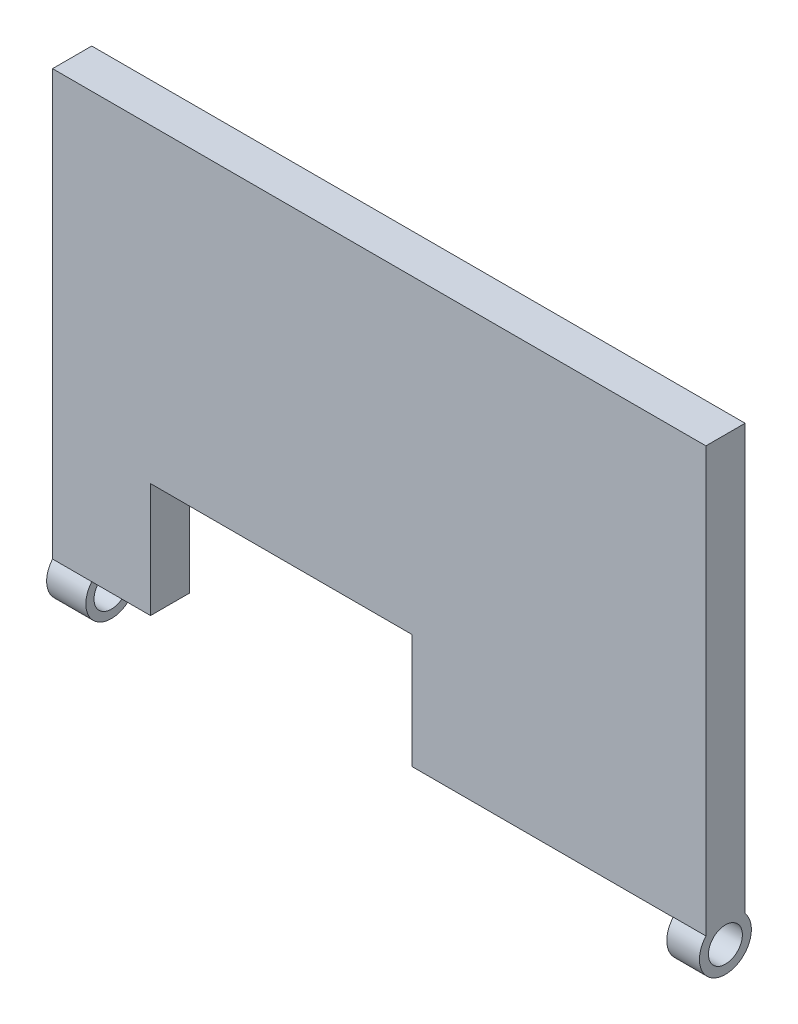
ISO-10303-21;
HEADER;
FILE_DESCRIPTION(('STEP AP214'),'2;1');
FILE_NAME('part.step','',(''),(''),'','','');
FILE_SCHEMA(('AUTOMOTIVE_DESIGN { 1 0 10303 214 1 1 1 1 }'));
ENDSEC;
DATA;
#1=APPLICATION_CONTEXT('core data for automotive mechanical design processes');
#2=APPLICATION_PROTOCOL_DEFINITION('international standard','automotive_design',2000,#1);
#3=PRODUCT_CONTEXT('',#1,'mechanical');
#4=PRODUCT('Part','Part','',(#3));
#5=PRODUCT_RELATED_PRODUCT_CATEGORY('part','',(#4));
#6=PRODUCT_DEFINITION_FORMATION('','',#4);
#7=PRODUCT_DEFINITION_CONTEXT('part definition',#1,'design');
#8=PRODUCT_DEFINITION('design','',#6,#7);
#9=PRODUCT_DEFINITION_SHAPE('','',#8);
#10=(LENGTH_UNIT() NAMED_UNIT(*) SI_UNIT(.MILLI.,.METRE.));
#11=(NAMED_UNIT(*) PLANE_ANGLE_UNIT() SI_UNIT($,.RADIAN.));
#12=(NAMED_UNIT(*) SI_UNIT($,.STERADIAN.) SOLID_ANGLE_UNIT());
#13=UNCERTAINTY_MEASURE_WITH_UNIT(LENGTH_MEASURE(1.E-05),#10,'distance_accuracy_value','');
#14=(GEOMETRIC_REPRESENTATION_CONTEXT(3) GLOBAL_UNCERTAINTY_ASSIGNED_CONTEXT((#13)) GLOBAL_UNIT_ASSIGNED_CONTEXT((#10,
#11,#12)) REPRESENTATION_CONTEXT('',''));
#15=CARTESIAN_POINT('',(0.,0.,0.));
#16=DIRECTION('',(0.,0.,1.));
#17=DIRECTION('',(1.,0.,0.));
#18=AXIS2_PLACEMENT_3D('',#15,#16,#17);
#19=CARTESIAN_POINT('',(0.,0.,6.));
#20=DIRECTION('',(0.,1.,0.));
#21=DIRECTION('',(0.,0.,1.));
#22=AXIS2_PLACEMENT_3D('',#19,#20,#21);
#23=PLANE('',#22);
#24=DIRECTION('',(1.,0.,0.));
#25=VECTOR('',#24,1.);
#26=CARTESIAN_POINT('',(0.,0.,0.));
#27=LINE('',#26,#25);
#28=CARTESIAN_POINT('',(-44.,0.,0.));
#29=VERTEX_POINT('',#28);
#30=CARTESIAN_POINT('',(-35.,0.,0.));
#31=VERTEX_POINT('',#30);
#32=EDGE_CURVE('E192',#29,#31,#27,.T.);
#33=ORIENTED_EDGE('',*,*,#32,.T.);
#34=DIRECTION('',(0.,0.,1.));
#35=VECTOR('',#34,1.);
#36=CARTESIAN_POINT('',(-35.,0.,-4.));
#37=LINE('',#36,#35);
#38=CARTESIAN_POINT('',(-35.,0.,6.));
#39=VERTEX_POINT('',#38);
#40=EDGE_CURVE('E220',#31,#39,#37,.T.);
#41=ORIENTED_EDGE('',*,*,#40,.T.);
#42=DIRECTION('',(1.,0.,0.));
#43=VECTOR('',#42,1.);
#44=CARTESIAN_POINT('',(-50.,0.,6.));
#45=LINE('',#44,#43);
#46=CARTESIAN_POINT('',(-44.,0.,6.));
#47=VERTEX_POINT('',#46);
#48=EDGE_CURVE('E160',#47,#39,#45,.T.);
#49=ORIENTED_EDGE('',*,*,#48,.F.);
#50=DIRECTION('',(0.,0.,1.));
#51=VECTOR('',#50,1.);
#52=CARTESIAN_POINT('',(-44.,0.,6.));
#53=LINE('',#52,#51);
#54=CARTESIAN_POINT('',(-44.,0.,3.87891979156235));
#55=VERTEX_POINT('',#54);
#56=EDGE_CURVE('E263',#55,#47,#53,.T.);
#57=ORIENTED_EDGE('',*,*,#56,.F.);
#58=DIRECTION('',(-1.,0.,0.));
#59=VECTOR('',#58,1.);
#60=CARTESIAN_POINT('',(-44.,0.,3.87891979156235));
#61=LINE('',#60,#59);
#62=CARTESIAN_POINT('',(-50.,0.,3.87891979156235));
#63=VERTEX_POINT('',#62);
#64=EDGE_CURVE('E271',#63,#55,#61,.F.);
#65=ORIENTED_EDGE('',*,*,#64,.F.);
#66=DIRECTION('',(0.,0.,-1.));
#67=VECTOR('',#66,1.);
#68=CARTESIAN_POINT('',(-50.,0.,6.));
#69=LINE('',#68,#67);
#70=CARTESIAN_POINT('',(-50.,0.,2.12108020843765));
#71=VERTEX_POINT('',#70);
#72=EDGE_CURVE('E186',#63,#71,#69,.T.);
#73=ORIENTED_EDGE('',*,*,#72,.T.);
#74=DIRECTION('',(-1.,0.,0.));
#75=VECTOR('',#74,1.);
#76=CARTESIAN_POINT('',(-44.,0.,2.12108020843765));
#77=LINE('',#76,#75);
#78=CARTESIAN_POINT('',(-44.,0.,2.12108020843765));
#79=VERTEX_POINT('',#78);
#80=EDGE_CURVE('E273',#79,#71,#77,.T.);
#81=ORIENTED_EDGE('',*,*,#80,.F.);
#82=EDGE_CURVE('E270',#29,#79,#53,.T.);
#83=ORIENTED_EDGE('',*,*,#82,.F.);
#84=EDGE_LOOP('',(#33,#41,#49,#57,#65,#73,#81,#83));
#85=FACE_BOUND('',#84,.T.);
#86=ADVANCED_FACE('F45',(#85),#23,.F.);
#87=CARTESIAN_POINT('',(5.,0.,6.));
#88=VERTEX_POINT('',#87);
#89=CARTESIAN_POINT('',(45.,0.,6.));
#90=VERTEX_POINT('',#89);
#91=EDGE_CURVE('E151',#88,#90,#45,.T.);
#92=ORIENTED_EDGE('',*,*,#91,.F.);
#93=DIRECTION('',(0.,0.,1.));
#94=VECTOR('',#93,1.);
#95=CARTESIAN_POINT('',(5.,0.,-4.));
#96=LINE('',#95,#94);
#97=CARTESIAN_POINT('',(5.,0.,0.));
#98=VERTEX_POINT('',#97);
#99=EDGE_CURVE('E136',#98,#88,#96,.T.);
#100=ORIENTED_EDGE('',*,*,#99,.F.);
#101=CARTESIAN_POINT('',(45.,0.,0.));
#102=VERTEX_POINT('',#101);
#103=EDGE_CURVE('E193',#98,#102,#27,.T.);
#104=ORIENTED_EDGE('',*,*,#103,.T.);
#105=DIRECTION('',(0.,0.,-1.));
#106=VECTOR('',#105,1.);
#107=CARTESIAN_POINT('',(45.,0.,6.));
#108=LINE('',#107,#106);
#109=EDGE_CURVE('E158',#90,#102,#108,.T.);
#110=ORIENTED_EDGE('',*,*,#109,.F.);
#111=EDGE_LOOP('',(#92,#100,#104,#110));
#112=FACE_BOUND('',#111,.T.);
#113=ADVANCED_FACE('F47',(#112),#23,.F.);
#114=CARTESIAN_POINT('',(50.,0.,6.));
#115=DIRECTION('',(-1.,0.,0.));
#116=DIRECTION('',(0.,0.,1.));
#117=AXIS2_PLACEMENT_3D('',#114,#115,#116);
#118=PLANE('',#117);
#119=CARTESIAN_POINT('',(50.,-2.58785291659843,3.01423134467239));
#120=DIRECTION('',(-1.,0.,0.));
#121=DIRECTION('',(0.,0.,1.));
#122=AXIS2_PLACEMENT_3D('',#119,#120,#121);
#123=CIRCLE('',#122,2.6);
#124=CARTESIAN_POINT('',(50.,-2.58785291659843,5.61423134467239));
#125=VERTEX_POINT('',#124);
#126=EDGE_CURVE('E230',#125,#125,#123,.T.);
#127=ORIENTED_EDGE('',*,*,#126,.T.);
#128=EDGE_LOOP('',(#127));
#129=FACE_BOUND('',#128,.T.);
#130=CARTESIAN_POINT('',(50.,-2.58785291659843,3.01423134467239));
#131=DIRECTION('',(1.,0.,0.));
#132=DIRECTION('',(0.,0.,-1.));
#133=AXIS2_PLACEMENT_3D('',#130,#131,#132);
#134=CIRCLE('',#133,3.9727286991629);
#135=CARTESIAN_POINT('',(50.,0.0327880076824464,6.));
#136=VERTEX_POINT('',#135);
#137=CARTESIAN_POINT('',(50.,0.,0.));
#138=VERTEX_POINT('',#137);
#139=EDGE_CURVE('E234',#136,#138,#134,.T.);
#140=ORIENTED_EDGE('',*,*,#139,.T.);
#141=DIRECTION('',(0.,1.,0.));
#142=VECTOR('',#141,1.);
#143=CARTESIAN_POINT('',(50.,0.,0.));
#144=LINE('',#143,#142);
#145=CARTESIAN_POINT('',(50.,65.,0.));
#146=VERTEX_POINT('',#145);
#147=EDGE_CURVE('E191',#138,#146,#144,.T.);
#148=ORIENTED_EDGE('',*,*,#147,.T.);
#149=DIRECTION('',(0.,0.,-1.));
#150=VECTOR('',#149,1.);
#151=CARTESIAN_POINT('',(50.,65.,6.));
#152=LINE('',#151,#150);
#153=CARTESIAN_POINT('',(50.,65.,6.));
#154=VERTEX_POINT('',#153);
#155=EDGE_CURVE('E204',#154,#146,#152,.T.);
#156=ORIENTED_EDGE('',*,*,#155,.F.);
#157=DIRECTION('',(0.,1.,0.));
#158=VECTOR('',#157,1.);
#159=CARTESIAN_POINT('',(50.,0.,6.));
#160=LINE('',#159,#158);
#161=EDGE_CURVE('E174',#136,#154,#160,.T.);
#162=ORIENTED_EDGE('',*,*,#161,.F.);
#163=EDGE_LOOP('',(#140,#148,#156,#162));
#164=FACE_BOUND('',#163,.T.);
#165=ADVANCED_FACE('F325',(#129,#164),#118,.F.);
#166=CARTESIAN_POINT('',(50.,65.,6.));
#167=DIRECTION('',(0.,-1.,0.));
#168=DIRECTION('',(1.,0.,0.));
#169=AXIS2_PLACEMENT_3D('',#166,#167,#168);
#170=PLANE('',#169);
#171=DIRECTION('',(-1.,0.,0.));
#172=VECTOR('',#171,1.);
#173=CARTESIAN_POINT('',(50.,65.,0.));
#174=LINE('',#173,#172);
#175=CARTESIAN_POINT('',(-50.,65.,0.));
#176=VERTEX_POINT('',#175);
#177=EDGE_CURVE('E168',#146,#176,#174,.T.);
#178=ORIENTED_EDGE('',*,*,#177,.T.);
#179=DIRECTION('',(0.,0.,-1.));
#180=VECTOR('',#179,1.);
#181=CARTESIAN_POINT('',(-50.,65.,6.));
#182=LINE('',#181,#180);
#183=CARTESIAN_POINT('',(-50.,65.,6.));
#184=VERTEX_POINT('',#183);
#185=EDGE_CURVE('E200',#184,#176,#182,.T.);
#186=ORIENTED_EDGE('',*,*,#185,.F.);
#187=DIRECTION('',(-1.,0.,0.));
#188=VECTOR('',#187,1.);
#189=CARTESIAN_POINT('',(50.,65.,6.));
#190=LINE('',#189,#188);
#191=EDGE_CURVE('E177',#154,#184,#190,.T.);
#192=ORIENTED_EDGE('',*,*,#191,.F.);
#193=ORIENTED_EDGE('',*,*,#155,.T.);
#194=EDGE_LOOP('',(#178,#186,#192,#193));
#195=FACE_BOUND('',#194,.T.);
#196=ADVANCED_FACE('F330',(#195),#170,.F.);
#197=CARTESIAN_POINT('',(-50.,65.,6.));
#198=DIRECTION('',(1.,0.,0.));
#199=DIRECTION('',(0.,0.,-1.));
#200=AXIS2_PLACEMENT_3D('',#197,#198,#199);
#201=PLANE('',#200);
#202=CARTESIAN_POINT('',(-50.,-2.5,3.));
#203=DIRECTION('',(-1.,0.,0.));
#204=DIRECTION('',(0.,0.,1.));
#205=AXIS2_PLACEMENT_3D('',#202,#203,#204);
#206=CIRCLE('',#205,2.65);
#207=EDGE_CURVE('E252',#71,#63,#206,.T.);
#208=ORIENTED_EDGE('',*,*,#207,.F.);
#209=ORIENTED_EDGE('',*,*,#72,.F.);
#210=EDGE_LOOP('',(#208,#209));
#211=FACE_BOUND('',#210,.T.);
#212=DIRECTION('',(0.,-1.,0.));
#213=VECTOR('',#212,1.);
#214=CARTESIAN_POINT('',(-50.,65.,0.));
#215=LINE('',#214,#213);
#216=CARTESIAN_POINT('',(-50.,0.,0.));
#217=VERTEX_POINT('',#216);
#218=EDGE_CURVE('E161',#176,#217,#215,.T.);
#219=ORIENTED_EDGE('',*,*,#218,.T.);
#220=CARTESIAN_POINT('',(-50.,-2.5,3.));
#221=DIRECTION('',(-1.,0.,0.));
#222=DIRECTION('',(0.,0.,1.));
#223=AXIS2_PLACEMENT_3D('',#220,#221,#222);
#224=CIRCLE('',#223,3.90512483795333);
#225=CARTESIAN_POINT('',(-50.,0.,6.));
#226=VERTEX_POINT('',#225);
#227=EDGE_CURVE('E257',#217,#226,#224,.T.);
#228=ORIENTED_EDGE('',*,*,#227,.T.);
#229=DIRECTION('',(0.,-1.,0.));
#230=VECTOR('',#229,1.);
#231=CARTESIAN_POINT('',(-50.,65.,6.));
#232=LINE('',#231,#230);
#233=EDGE_CURVE('E181',#184,#226,#232,.T.);
#234=ORIENTED_EDGE('',*,*,#233,.F.);
#235=ORIENTED_EDGE('',*,*,#185,.T.);
#236=EDGE_LOOP('',(#219,#228,#234,#235));
#237=FACE_BOUND('',#236,.T.);
#238=ADVANCED_FACE('F297',(#211,#237),#201,.F.);
#239=CARTESIAN_POINT('',(0.,0.,6.));
#240=DIRECTION('',(0.,0.,1.));
#241=DIRECTION('',(1.,0.,0.));
#242=AXIS2_PLACEMENT_3D('',#239,#240,#241);
#243=PLANE('',#242);
#244=DIRECTION('',(0.,-1.,0.));
#245=VECTOR('',#244,1.);
#246=CARTESIAN_POINT('',(-35.,0.,6.));
#247=LINE('',#246,#245);
#248=CARTESIAN_POINT('',(-35.,17.5,6.));
#249=VERTEX_POINT('',#248);
#250=EDGE_CURVE('E147',#249,#39,#247,.T.);
#251=ORIENTED_EDGE('',*,*,#250,.F.);
#252=DIRECTION('',(-1.,0.,0.));
#253=VECTOR('',#252,1.);
#254=CARTESIAN_POINT('',(-35.,17.5,6.));
#255=LINE('',#254,#253);
#256=CARTESIAN_POINT('',(5.,17.5,6.));
#257=VERTEX_POINT('',#256);
#258=EDGE_CURVE('E154',#257,#249,#255,.T.);
#259=ORIENTED_EDGE('',*,*,#258,.F.);
#260=DIRECTION('',(0.,1.,0.));
#261=VECTOR('',#260,1.);
#262=CARTESIAN_POINT('',(5.,17.5,6.));
#263=LINE('',#262,#261);
#264=EDGE_CURVE('E139',#88,#257,#263,.T.);
#265=ORIENTED_EDGE('',*,*,#264,.F.);
#266=ORIENTED_EDGE('',*,*,#91,.T.);
#267=DIRECTION('',(0.,1.,0.));
#268=VECTOR('',#267,1.);
#269=CARTESIAN_POINT('',(45.,0.,6.));
#270=LINE('',#269,#268);
#271=CARTESIAN_POINT('',(45.,0.0327880076824464,6.));
#272=VERTEX_POINT('',#271);
#273=EDGE_CURVE('E69',#90,#272,#270,.T.);
#274=ORIENTED_EDGE('',*,*,#273,.T.);
#275=DIRECTION('',(1.,0.,0.));
#276=VECTOR('',#275,1.);
#277=CARTESIAN_POINT('',(45.,0.0327880076824464,6.));
#278=LINE('',#277,#276);
#279=EDGE_CURVE('E249',#136,#272,#278,.F.);
#280=ORIENTED_EDGE('',*,*,#279,.F.);
#281=ORIENTED_EDGE('',*,*,#161,.T.);
#282=ORIENTED_EDGE('',*,*,#191,.T.);
#283=ORIENTED_EDGE('',*,*,#233,.T.);
#284=EDGE_CURVE('E163',#226,#47,#45,.T.);
#285=ORIENTED_EDGE('',*,*,#284,.T.);
#286=ORIENTED_EDGE('',*,*,#48,.T.);
#287=EDGE_LOOP('',(#251,#259,#265,#266,#274,#280,#281,#282,#283,#285,#286));
#288=FACE_BOUND('',#287,.T.);
#289=ADVANCED_FACE('F150',(#288),#243,.T.);
#290=CARTESIAN_POINT('',(0.,0.,0.));
#291=DIRECTION('',(0.,0.,1.));
#292=DIRECTION('',(1.,0.,0.));
#293=AXIS2_PLACEMENT_3D('',#290,#291,#292);
#294=PLANE('',#293);
#295=DIRECTION('',(-1.,0.,0.));
#296=VECTOR('',#295,1.);
#297=CARTESIAN_POINT('',(0.,17.5,0.));
#298=LINE('',#297,#296);
#299=CARTESIAN_POINT('',(5.,17.5,0.));
#300=VERTEX_POINT('',#299);
#301=CARTESIAN_POINT('',(-35.,17.5,0.));
#302=VERTEX_POINT('',#301);
#303=EDGE_CURVE('E54',#300,#302,#298,.T.);
#304=ORIENTED_EDGE('',*,*,#303,.T.);
#305=DIRECTION('',(0.,-1.,0.));
#306=VECTOR('',#305,1.);
#307=CARTESIAN_POINT('',(-35.,0.,0.));
#308=LINE('',#307,#306);
#309=EDGE_CURVE('E11',#302,#31,#308,.T.);
#310=ORIENTED_EDGE('',*,*,#309,.T.);
#311=ORIENTED_EDGE('',*,*,#32,.F.);
#312=EDGE_CURVE('E187',#217,#29,#27,.T.);
#313=ORIENTED_EDGE('',*,*,#312,.F.);
#314=ORIENTED_EDGE('',*,*,#218,.F.);
#315=ORIENTED_EDGE('',*,*,#177,.F.);
#316=ORIENTED_EDGE('',*,*,#147,.F.);
#317=EDGE_CURVE('E276',#102,#138,#27,.T.);
#318=ORIENTED_EDGE('',*,*,#317,.F.);
#319=ORIENTED_EDGE('',*,*,#103,.F.);
#320=DIRECTION('',(0.,1.,0.));
#321=VECTOR('',#320,1.);
#322=CARTESIAN_POINT('',(5.,0.,0.));
#323=LINE('',#322,#321);
#324=EDGE_CURVE('E142',#98,#300,#323,.T.);
#325=ORIENTED_EDGE('',*,*,#324,.T.);
#326=EDGE_LOOP('',(#304,#310,#311,#313,#314,#315,#316,#318,#319,#325));
#327=FACE_BOUND('',#326,.T.);
#328=ADVANCED_FACE('F212',(#327),#294,.F.);
#329=CARTESIAN_POINT('',(-44.,-2.5,3.));
#330=DIRECTION('',(-1.,0.,0.));
#331=DIRECTION('',(0.,0.,1.));
#332=AXIS2_PLACEMENT_3D('',#329,#330,#331);
#333=CYLINDRICAL_SURFACE('',#332,2.65);
#334=CARTESIAN_POINT('',(-44.,-2.5,3.));
#335=DIRECTION('',(-1.,0.,0.));
#336=DIRECTION('',(0.,0.,1.));
#337=AXIS2_PLACEMENT_3D('',#334,#335,#336);
#338=CIRCLE('',#337,2.65);
#339=EDGE_CURVE('E253',#79,#55,#338,.T.);
#340=ORIENTED_EDGE('',*,*,#339,.F.);
#341=ORIENTED_EDGE('',*,*,#80,.T.);
#342=ORIENTED_EDGE('',*,*,#207,.T.);
#343=ORIENTED_EDGE('',*,*,#64,.T.);
#344=EDGE_LOOP('',(#340,#341,#342,#343));
#345=FACE_BOUND('',#344,.T.);
#346=ADVANCED_FACE('F345',(#345),#333,.F.);
#347=CARTESIAN_POINT('',(-44.,-2.5,3.));
#348=DIRECTION('',(-1.,0.,0.));
#349=DIRECTION('',(0.,0.,1.));
#350=AXIS2_PLACEMENT_3D('',#347,#348,#349);
#351=PLANE('',#350);
#352=CARTESIAN_POINT('',(-44.,-2.5,3.));
#353=DIRECTION('',(-1.,0.,0.));
#354=DIRECTION('',(0.,0.,1.));
#355=AXIS2_PLACEMENT_3D('',#352,#353,#354);
#356=CIRCLE('',#355,3.90512483795333);
#357=EDGE_CURVE('E260',#29,#47,#356,.T.);
#358=ORIENTED_EDGE('',*,*,#357,.F.);
#359=ORIENTED_EDGE('',*,*,#82,.T.);
#360=ORIENTED_EDGE('',*,*,#339,.T.);
#361=ORIENTED_EDGE('',*,*,#56,.T.);
#362=EDGE_LOOP('',(#358,#359,#360,#361));
#363=FACE_BOUND('',#362,.T.);
#364=ADVANCED_FACE('F303',(#363),#351,.F.);
#365=CARTESIAN_POINT('',(-44.,-2.5,3.));
#366=DIRECTION('',(-1.,0.,0.));
#367=DIRECTION('',(0.,0.,1.));
#368=AXIS2_PLACEMENT_3D('',#365,#366,#367);
#369=CYLINDRICAL_SURFACE('',#368,3.90512483795333);
#370=ORIENTED_EDGE('',*,*,#357,.T.);
#371=ORIENTED_EDGE('',*,*,#284,.F.);
#372=ORIENTED_EDGE('',*,*,#227,.F.);
#373=ORIENTED_EDGE('',*,*,#312,.T.);
#374=EDGE_LOOP('',(#370,#371,#372,#373));
#375=FACE_BOUND('',#374,.T.);
#376=ADVANCED_FACE('F300',(#375),#369,.T.);
#377=CARTESIAN_POINT('',(45.,-2.58785291659843,3.01423134467239));
#378=DIRECTION('',(1.,0.,0.));
#379=DIRECTION('',(0.,0.,-1.));
#380=AXIS2_PLACEMENT_3D('',#377,#378,#379);
#381=PLANE('',#380);
#382=ORIENTED_EDGE('',*,*,#273,.F.);
#383=ORIENTED_EDGE('',*,*,#109,.T.);
#384=CARTESIAN_POINT('',(45.,-2.58785291659843,3.01423134467239));
#385=DIRECTION('',(1.,0.,0.));
#386=DIRECTION('',(0.,0.,-1.));
#387=AXIS2_PLACEMENT_3D('',#384,#385,#386);
#388=CIRCLE('',#387,3.9727286991629);
#389=EDGE_CURVE('E238',#272,#102,#388,.T.);
#390=ORIENTED_EDGE('',*,*,#389,.F.);
#391=EDGE_LOOP('',(#382,#383,#390));
#392=FACE_BOUND('',#391,.T.);
#393=ADVANCED_FACE('F349',(#392),#381,.F.);
#394=CARTESIAN_POINT('',(45.,-2.58785291659843,3.01423134467239));
#395=DIRECTION('',(1.,0.,0.));
#396=DIRECTION('',(0.,0.,-1.));
#397=AXIS2_PLACEMENT_3D('',#394,#395,#396);
#398=CYLINDRICAL_SURFACE('',#397,3.9727286991629);
#399=ORIENTED_EDGE('',*,*,#139,.F.);
#400=ORIENTED_EDGE('',*,*,#279,.T.);
#401=ORIENTED_EDGE('',*,*,#389,.T.);
#402=ORIENTED_EDGE('',*,*,#317,.T.);
#403=EDGE_LOOP('',(#399,#400,#401,#402));
#404=FACE_BOUND('',#403,.T.);
#405=ADVANCED_FACE('F354',(#404),#398,.T.);
#406=CARTESIAN_POINT('',(50.,-2.58785291659843,3.01423134467239));
#407=DIRECTION('',(-1.,0.,0.));
#408=DIRECTION('',(0.,0.,1.));
#409=AXIS2_PLACEMENT_3D('',#406,#407,#408);
#410=CYLINDRICAL_SURFACE('',#409,2.6);
#411=ORIENTED_EDGE('',*,*,#126,.F.);
#412=EDGE_LOOP('',(#411));
#413=FACE_BOUND('',#412,.T.);
#414=CARTESIAN_POINT('',(45.8,-2.58785291659843,3.01423134467239));
#415=DIRECTION('',(-1.,0.,0.));
#416=DIRECTION('',(0.,0.,1.));
#417=AXIS2_PLACEMENT_3D('',#414,#415,#416);
#418=CIRCLE('',#417,2.6);
#419=CARTESIAN_POINT('',(45.8,-2.58785291659843,5.61423134467239));
#420=VERTEX_POINT('',#419);
#421=EDGE_CURVE('E225',#420,#420,#418,.T.);
#422=ORIENTED_EDGE('',*,*,#421,.T.);
#423=EDGE_LOOP('',(#422));
#424=FACE_BOUND('',#423,.T.);
#425=ADVANCED_FACE('F318',(#413,#424),#410,.F.);
#426=CARTESIAN_POINT('',(45.8,-2.58785291659843,3.01423134467239));
#427=DIRECTION('',(-1.,0.,0.));
#428=DIRECTION('',(0.,0.,1.));
#429=AXIS2_PLACEMENT_3D('',#426,#427,#428);
#430=PLANE('',#429);
#431=ORIENTED_EDGE('',*,*,#421,.F.);
#432=EDGE_LOOP('',(#431));
#433=FACE_BOUND('',#432,.T.);
#434=ADVANCED_FACE('F310',(#433),#430,.F.);
#435=CARTESIAN_POINT('',(-35.,0.,-4.));
#436=DIRECTION('',(-1.,0.,0.));
#437=DIRECTION('',(0.,0.,1.));
#438=AXIS2_PLACEMENT_3D('',#435,#436,#437);
#439=PLANE('',#438);
#440=DIRECTION('',(0.,0.,1.));
#441=VECTOR('',#440,1.);
#442=CARTESIAN_POINT('',(-35.,17.5,-4.));
#443=LINE('',#442,#441);
#444=EDGE_CURVE('E217',#302,#249,#443,.T.);
#445=ORIENTED_EDGE('',*,*,#444,.T.);
#446=ORIENTED_EDGE('',*,*,#250,.T.);
#447=ORIENTED_EDGE('',*,*,#40,.F.);
#448=ORIENTED_EDGE('',*,*,#309,.F.);
#449=EDGE_LOOP('',(#445,#446,#447,#448));
#450=FACE_BOUND('',#449,.T.);
#451=ADVANCED_FACE('F308',(#450),#439,.F.);
#452=CARTESIAN_POINT('',(-35.,17.5,-4.));
#453=DIRECTION('',(0.,1.,0.));
#454=DIRECTION('',(0.,0.,1.));
#455=AXIS2_PLACEMENT_3D('',#452,#453,#454);
#456=PLANE('',#455);
#457=DIRECTION('',(0.,0.,1.));
#458=VECTOR('',#457,1.);
#459=CARTESIAN_POINT('',(5.,17.5,-4.));
#460=LINE('',#459,#458);
#461=EDGE_CURVE('E61',#300,#257,#460,.T.);
#462=ORIENTED_EDGE('',*,*,#461,.T.);
#463=ORIENTED_EDGE('',*,*,#258,.T.);
#464=ORIENTED_EDGE('',*,*,#444,.F.);
#465=ORIENTED_EDGE('',*,*,#303,.F.);
#466=EDGE_LOOP('',(#462,#463,#464,#465));
#467=FACE_BOUND('',#466,.T.);
#468=ADVANCED_FACE('F216',(#467),#456,.F.);
#469=CARTESIAN_POINT('',(5.,17.5,-4.));
#470=DIRECTION('',(1.,0.,0.));
#471=DIRECTION('',(0.,0.,-1.));
#472=AXIS2_PLACEMENT_3D('',#469,#470,#471);
#473=PLANE('',#472);
#474=ORIENTED_EDGE('',*,*,#99,.T.);
#475=ORIENTED_EDGE('',*,*,#264,.T.);
#476=ORIENTED_EDGE('',*,*,#461,.F.);
#477=ORIENTED_EDGE('',*,*,#324,.F.);
#478=EDGE_LOOP('',(#474,#475,#476,#477));
#479=FACE_BOUND('',#478,.T.);
#480=ADVANCED_FACE('F138',(#479),#473,.F.);
#481=CLOSED_SHELL('',(#86,#113,#165,#196,#238,#289,#328,#346,#364,#376,#393,#405,#425,#434,#451,
#468,#480));
#482=MANIFOLD_SOLID_BREP('B2',#481);
#483=ADVANCED_BREP_SHAPE_REPRESENTATION('',(#18,#482),#14);
#484=SHAPE_DEFINITION_REPRESENTATION(#9,#483);
ENDSEC;
END-ISO-10303-21;
